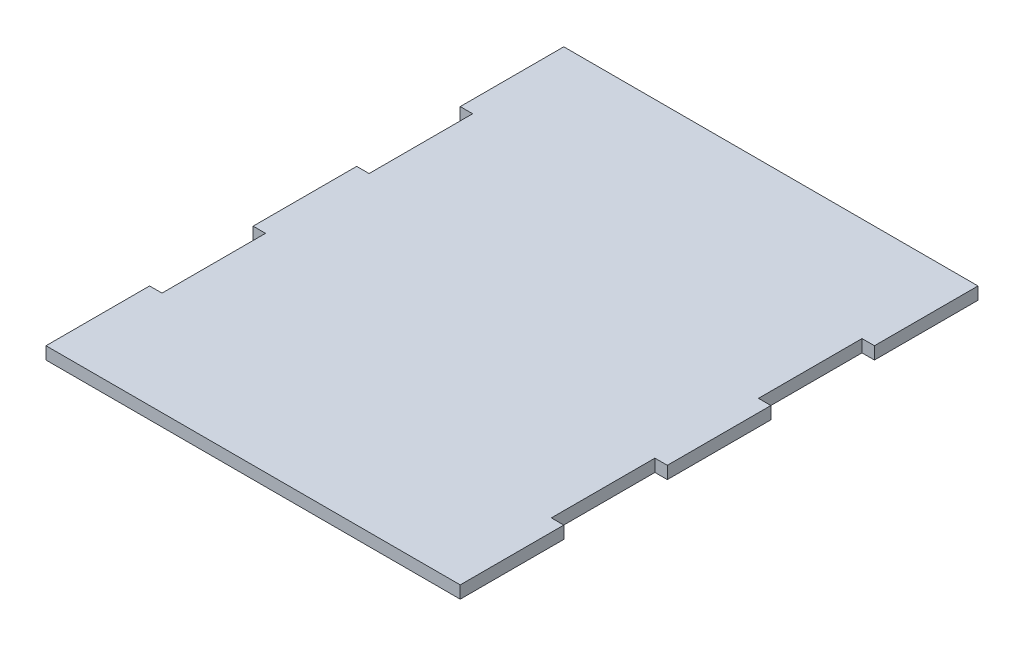
ISO-10303-21;
HEADER;
FILE_DESCRIPTION(('STEP AP214'),'2;1');
FILE_NAME('part.step','',(''),(''),'','','');
FILE_SCHEMA(('AUTOMOTIVE_DESIGN { 1 0 10303 214 1 1 1 1 }'));
ENDSEC;
DATA;
#1=APPLICATION_CONTEXT('core data for automotive mechanical design processes');
#2=APPLICATION_PROTOCOL_DEFINITION('international standard','automotive_design',2000,#1);
#3=PRODUCT_CONTEXT('',#1,'mechanical');
#4=PRODUCT('Part','Part','',(#3));
#5=PRODUCT_RELATED_PRODUCT_CATEGORY('part','',(#4));
#6=PRODUCT_DEFINITION_FORMATION('','',#4);
#7=PRODUCT_DEFINITION_CONTEXT('part definition',#1,'design');
#8=PRODUCT_DEFINITION('design','',#6,#7);
#9=PRODUCT_DEFINITION_SHAPE('','',#8);
#10=(LENGTH_UNIT() NAMED_UNIT(*) SI_UNIT(.MILLI.,.METRE.));
#11=(NAMED_UNIT(*) PLANE_ANGLE_UNIT() SI_UNIT($,.RADIAN.));
#12=(NAMED_UNIT(*) SI_UNIT($,.STERADIAN.) SOLID_ANGLE_UNIT());
#13=UNCERTAINTY_MEASURE_WITH_UNIT(LENGTH_MEASURE(1.E-05),#10,'distance_accuracy_value','');
#14=(GEOMETRIC_REPRESENTATION_CONTEXT(3) GLOBAL_UNCERTAINTY_ASSIGNED_CONTEXT((#13)) GLOBAL_UNIT_ASSIGNED_CONTEXT((#10,
#11,#12)) REPRESENTATION_CONTEXT('',''));
#15=CARTESIAN_POINT('',(0.,0.,0.));
#16=DIRECTION('',(0.,0.,1.));
#17=DIRECTION('',(1.,0.,0.));
#18=AXIS2_PLACEMENT_3D('',#15,#16,#17);
#19=CARTESIAN_POINT('',(100.,6.,-125.));
#20=DIRECTION('',(-1.,0.,0.));
#21=DIRECTION('',(0.,0.,1.));
#22=AXIS2_PLACEMENT_3D('',#19,#20,#21);
#23=PLANE('',#22);
#24=DIRECTION('',(0.,0.,-1.));
#25=VECTOR('',#24,1.);
#26=CARTESIAN_POINT('',(100.,6.,-125.));
#27=LINE('',#26,#25);
#28=CARTESIAN_POINT('',(100.000000000001,6.,25.));
#29=VERTEX_POINT('',#28);
#30=CARTESIAN_POINT('',(100.,6.,-25.));
#31=VERTEX_POINT('',#30);
#32=EDGE_CURVE('E334',#29,#31,#27,.T.);
#33=ORIENTED_EDGE('',*,*,#32,.F.);
#34=DIRECTION('',(0.,1.,0.));
#35=VECTOR('',#34,1.);
#36=CARTESIAN_POINT('',(100.000000000001,0.,25.));
#37=LINE('',#36,#35);
#38=CARTESIAN_POINT('',(100.000000000001,0.,25.));
#39=VERTEX_POINT('',#38);
#40=EDGE_CURVE('E214',#39,#29,#37,.T.);
#41=ORIENTED_EDGE('',*,*,#40,.F.);
#42=DIRECTION('',(0.,0.,-1.));
#43=VECTOR('',#42,1.);
#44=CARTESIAN_POINT('',(100.,0.,-125.));
#45=LINE('',#44,#43);
#46=CARTESIAN_POINT('',(100.,0.,-25.));
#47=VERTEX_POINT('',#46);
#48=EDGE_CURVE('E353',#39,#47,#45,.T.);
#49=ORIENTED_EDGE('',*,*,#48,.T.);
#50=DIRECTION('',(0.,1.,0.));
#51=VECTOR('',#50,1.);
#52=CARTESIAN_POINT('',(100.,0.,-25.));
#53=LINE('',#52,#51);
#54=EDGE_CURVE('E221',#47,#31,#53,.T.);
#55=ORIENTED_EDGE('',*,*,#54,.T.);
#56=EDGE_LOOP('',(#33,#41,#49,#55));
#57=FACE_BOUND('',#56,.T.);
#58=ADVANCED_FACE('F39',(#57),#23,.F.);
#59=CARTESIAN_POINT('',(100.,6.,-75.));
#60=VERTEX_POINT('',#59);
#61=CARTESIAN_POINT('',(100.,6.,-125.));
#62=VERTEX_POINT('',#61);
#63=EDGE_CURVE('E335',#60,#62,#27,.T.);
#64=ORIENTED_EDGE('',*,*,#63,.F.);
#65=DIRECTION('',(0.,1.,0.));
#66=VECTOR('',#65,1.);
#67=CARTESIAN_POINT('',(100.,0.,-75.));
#68=LINE('',#67,#66);
#69=CARTESIAN_POINT('',(100.,0.,-75.));
#70=VERTEX_POINT('',#69);
#71=EDGE_CURVE('E217',#70,#60,#68,.T.);
#72=ORIENTED_EDGE('',*,*,#71,.F.);
#73=CARTESIAN_POINT('',(100.,0.,-125.));
#74=VERTEX_POINT('',#73);
#75=EDGE_CURVE('E202',#70,#74,#45,.T.);
#76=ORIENTED_EDGE('',*,*,#75,.T.);
#77=DIRECTION('',(0.,-1.,0.));
#78=VECTOR('',#77,1.);
#79=CARTESIAN_POINT('',(100.,6.,-125.));
#80=LINE('',#79,#78);
#81=EDGE_CURVE('E11',#62,#74,#80,.T.);
#82=ORIENTED_EDGE('',*,*,#81,.F.);
#83=EDGE_LOOP('',(#64,#72,#76,#82));
#84=FACE_BOUND('',#83,.T.);
#85=ADVANCED_FACE('F392',(#84),#23,.F.);
#86=CARTESIAN_POINT('',(-100.,6.,-125.));
#87=DIRECTION('',(1.,0.,0.));
#88=DIRECTION('',(0.,0.,-1.));
#89=AXIS2_PLACEMENT_3D('',#86,#87,#88);
#90=PLANE('',#89);
#91=DIRECTION('',(0.,0.,1.));
#92=VECTOR('',#91,1.);
#93=CARTESIAN_POINT('',(-100.,0.,-125.));
#94=LINE('',#93,#92);
#95=CARTESIAN_POINT('',(-100.,0.,-25.));
#96=VERTEX_POINT('',#95);
#97=CARTESIAN_POINT('',(-99.999999999999,0.,25.));
#98=VERTEX_POINT('',#97);
#99=EDGE_CURVE('E362',#96,#98,#94,.T.);
#100=ORIENTED_EDGE('',*,*,#99,.T.);
#101=DIRECTION('',(0.,1.,0.));
#102=VECTOR('',#101,1.);
#103=CARTESIAN_POINT('',(-99.999999999999,0.,25.));
#104=LINE('',#103,#102);
#105=CARTESIAN_POINT('',(-99.999999999999,6.,25.));
#106=VERTEX_POINT('',#105);
#107=EDGE_CURVE('E272',#98,#106,#104,.T.);
#108=ORIENTED_EDGE('',*,*,#107,.T.);
#109=DIRECTION('',(0.,0.,1.));
#110=VECTOR('',#109,1.);
#111=CARTESIAN_POINT('',(-100.,6.,-125.));
#112=LINE('',#111,#110);
#113=CARTESIAN_POINT('',(-100.,6.,-25.));
#114=VERTEX_POINT('',#113);
#115=EDGE_CURVE('E344',#114,#106,#112,.T.);
#116=ORIENTED_EDGE('',*,*,#115,.F.);
#117=DIRECTION('',(0.,1.,0.));
#118=VECTOR('',#117,1.);
#119=CARTESIAN_POINT('',(-100.,0.,-25.));
#120=LINE('',#119,#118);
#121=EDGE_CURVE('E307',#96,#114,#120,.T.);
#122=ORIENTED_EDGE('',*,*,#121,.F.);
#123=EDGE_LOOP('',(#100,#108,#116,#122));
#124=FACE_BOUND('',#123,.T.);
#125=ADVANCED_FACE('F435',(#124),#90,.F.);
#126=CARTESIAN_POINT('',(-100.,0.,-125.));
#127=VERTEX_POINT('',#126);
#128=CARTESIAN_POINT('',(-100.,0.,-75.));
#129=VERTEX_POINT('',#128);
#130=EDGE_CURVE('E357',#127,#129,#94,.T.);
#131=ORIENTED_EDGE('',*,*,#130,.T.);
#132=DIRECTION('',(0.,1.,0.));
#133=VECTOR('',#132,1.);
#134=CARTESIAN_POINT('',(-100.,0.,-75.));
#135=LINE('',#134,#133);
#136=CARTESIAN_POINT('',(-100.,6.,-75.));
#137=VERTEX_POINT('',#136);
#138=EDGE_CURVE('E317',#129,#137,#135,.T.);
#139=ORIENTED_EDGE('',*,*,#138,.T.);
#140=CARTESIAN_POINT('',(-100.,6.,-125.));
#141=VERTEX_POINT('',#140);
#142=EDGE_CURVE('E339',#141,#137,#112,.T.);
#143=ORIENTED_EDGE('',*,*,#142,.F.);
#144=DIRECTION('',(0.,-1.,0.));
#145=VECTOR('',#144,1.);
#146=CARTESIAN_POINT('',(-100.,6.,-125.));
#147=LINE('',#146,#145);
#148=EDGE_CURVE('E48',#141,#127,#147,.T.);
#149=ORIENTED_EDGE('',*,*,#148,.T.);
#150=EDGE_LOOP('',(#131,#139,#143,#149));
#151=FACE_BOUND('',#150,.T.);
#152=ADVANCED_FACE('F377',(#151),#90,.F.);
#153=CARTESIAN_POINT('',(100.,0.,125.));
#154=VERTEX_POINT('',#153);
#155=CARTESIAN_POINT('',(100.000000000001,0.,75.));
#156=VERTEX_POINT('',#155);
#157=EDGE_CURVE('E348',#154,#156,#45,.T.);
#158=ORIENTED_EDGE('',*,*,#157,.T.);
#159=DIRECTION('',(0.,1.,0.));
#160=VECTOR('',#159,1.);
#161=CARTESIAN_POINT('',(100.000000000001,0.,75.));
#162=LINE('',#161,#160);
#163=CARTESIAN_POINT('',(100.000000000001,6.,75.));
#164=VERTEX_POINT('',#163);
#165=EDGE_CURVE('E252',#156,#164,#162,.T.);
#166=ORIENTED_EDGE('',*,*,#165,.T.);
#167=CARTESIAN_POINT('',(100.,6.,125.));
#168=VERTEX_POINT('',#167);
#169=EDGE_CURVE('E329',#168,#164,#27,.T.);
#170=ORIENTED_EDGE('',*,*,#169,.F.);
#171=DIRECTION('',(0.,-1.,0.));
#172=VECTOR('',#171,1.);
#173=CARTESIAN_POINT('',(100.,6.,125.));
#174=LINE('',#173,#172);
#175=EDGE_CURVE('E347',#168,#154,#174,.T.);
#176=ORIENTED_EDGE('',*,*,#175,.T.);
#177=EDGE_LOOP('',(#158,#166,#170,#176));
#178=FACE_BOUND('',#177,.T.);
#179=ADVANCED_FACE('F41',(#178),#23,.F.);
#180=CARTESIAN_POINT('',(-100.,6.,-125.));
#181=DIRECTION('',(0.,0.,1.));
#182=DIRECTION('',(1.,0.,0.));
#183=AXIS2_PLACEMENT_3D('',#180,#181,#182);
#184=PLANE('',#183);
#185=DIRECTION('',(-1.,0.,0.));
#186=VECTOR('',#185,1.);
#187=CARTESIAN_POINT('',(-100.,0.,-125.));
#188=LINE('',#187,#186);
#189=EDGE_CURVE('E352',#74,#127,#188,.T.);
#190=ORIENTED_EDGE('',*,*,#189,.T.);
#191=ORIENTED_EDGE('',*,*,#148,.F.);
#192=DIRECTION('',(-1.,0.,0.));
#193=VECTOR('',#192,1.);
#194=CARTESIAN_POINT('',(-100.,6.,-125.));
#195=LINE('',#194,#193);
#196=EDGE_CURVE('E333',#62,#141,#195,.T.);
#197=ORIENTED_EDGE('',*,*,#196,.F.);
#198=ORIENTED_EDGE('',*,*,#81,.T.);
#199=EDGE_LOOP('',(#190,#191,#197,#198));
#200=FACE_BOUND('',#199,.T.);
#201=ADVANCED_FACE('F390',(#200),#184,.F.);
#202=CARTESIAN_POINT('',(-99.999999999999,6.,75.));
#203=VERTEX_POINT('',#202);
#204=CARTESIAN_POINT('',(-100.,6.,125.));
#205=VERTEX_POINT('',#204);
#206=EDGE_CURVE('E338',#203,#205,#112,.T.);
#207=ORIENTED_EDGE('',*,*,#206,.F.);
#208=DIRECTION('',(0.,1.,0.));
#209=VECTOR('',#208,1.);
#210=CARTESIAN_POINT('',(-99.999999999999,0.,75.));
#211=LINE('',#210,#209);
#212=CARTESIAN_POINT('',(-99.999999999999,0.,75.));
#213=VERTEX_POINT('',#212);
#214=EDGE_CURVE('E288',#213,#203,#211,.T.);
#215=ORIENTED_EDGE('',*,*,#214,.F.);
#216=CARTESIAN_POINT('',(-100.,0.,125.));
#217=VERTEX_POINT('',#216);
#218=EDGE_CURVE('E356',#213,#217,#94,.T.);
#219=ORIENTED_EDGE('',*,*,#218,.T.);
#220=DIRECTION('',(0.,-1.,0.));
#221=VECTOR('',#220,1.);
#222=CARTESIAN_POINT('',(-100.,6.,125.));
#223=LINE('',#222,#221);
#224=EDGE_CURVE('E368',#205,#217,#223,.T.);
#225=ORIENTED_EDGE('',*,*,#224,.F.);
#226=EDGE_LOOP('',(#207,#215,#219,#225));
#227=FACE_BOUND('',#226,.T.);
#228=ADVANCED_FACE('F416',(#227),#90,.F.);
#229=CARTESIAN_POINT('',(-100.,6.,125.));
#230=DIRECTION('',(0.,0.,-1.));
#231=DIRECTION('',(-1.,0.,0.));
#232=AXIS2_PLACEMENT_3D('',#229,#230,#231);
#233=PLANE('',#232);
#234=DIRECTION('',(1.,0.,0.));
#235=VECTOR('',#234,1.);
#236=CARTESIAN_POINT('',(-100.,0.,125.));
#237=LINE('',#236,#235);
#238=EDGE_CURVE('E361',#217,#154,#237,.T.);
#239=ORIENTED_EDGE('',*,*,#238,.T.);
#240=ORIENTED_EDGE('',*,*,#175,.F.);
#241=DIRECTION('',(1.,0.,0.));
#242=VECTOR('',#241,1.);
#243=CARTESIAN_POINT('',(-100.,6.,125.));
#244=LINE('',#243,#242);
#245=EDGE_CURVE('E343',#205,#168,#244,.T.);
#246=ORIENTED_EDGE('',*,*,#245,.F.);
#247=ORIENTED_EDGE('',*,*,#224,.T.);
#248=EDGE_LOOP('',(#239,#240,#246,#247));
#249=FACE_BOUND('',#248,.T.);
#250=ADVANCED_FACE('F420',(#249),#233,.F.);
#251=CARTESIAN_POINT('',(0.,6.,0.));
#252=DIRECTION('',(0.,1.,0.));
#253=DIRECTION('',(0.,0.,1.));
#254=AXIS2_PLACEMENT_3D('',#251,#252,#253);
#255=PLANE('',#254);
#256=DIRECTION('',(-1.,0.,0.));
#257=VECTOR('',#256,1.);
#258=CARTESIAN_POINT('',(-99.999999999999,6.,25.));
#259=LINE('',#258,#257);
#260=CARTESIAN_POINT('',(-93.999999999999,6.,25.));
#261=VERTEX_POINT('',#260);
#262=EDGE_CURVE('E273',#261,#106,#259,.T.);
#263=ORIENTED_EDGE('',*,*,#262,.F.);
#264=DIRECTION('',(0.,0.,-1.));
#265=VECTOR('',#264,1.);
#266=CARTESIAN_POINT('',(-93.999999999999,6.,25.));
#267=LINE('',#266,#265);
#268=CARTESIAN_POINT('',(-93.999999999999,6.,75.));
#269=VERTEX_POINT('',#268);
#270=EDGE_CURVE('E266',#269,#261,#267,.T.);
#271=ORIENTED_EDGE('',*,*,#270,.F.);
#272=DIRECTION('',(1.,0.,0.));
#273=VECTOR('',#272,1.);
#274=CARTESIAN_POINT('',(-99.999999999999,6.,75.));
#275=LINE('',#274,#273);
#276=EDGE_CURVE('E276',#203,#269,#275,.T.);
#277=ORIENTED_EDGE('',*,*,#276,.F.);
#278=ORIENTED_EDGE('',*,*,#206,.T.);
#279=ORIENTED_EDGE('',*,*,#245,.T.);
#280=ORIENTED_EDGE('',*,*,#169,.T.);
#281=DIRECTION('',(1.,0.,0.));
#282=VECTOR('',#281,1.);
#283=CARTESIAN_POINT('',(94.0000000000011,6.,75.));
#284=LINE('',#283,#282);
#285=CARTESIAN_POINT('',(94.0000000000011,6.,75.));
#286=VERTEX_POINT('',#285);
#287=EDGE_CURVE('E232',#286,#164,#284,.T.);
#288=ORIENTED_EDGE('',*,*,#287,.F.);
#289=DIRECTION('',(0.,0.,1.));
#290=VECTOR('',#289,1.);
#291=CARTESIAN_POINT('',(94.0000000000011,6.,25.));
#292=LINE('',#291,#290);
#293=CARTESIAN_POINT('',(94.0000000000011,6.,25.));
#294=VERTEX_POINT('',#293);
#295=EDGE_CURVE('E243',#294,#286,#292,.T.);
#296=ORIENTED_EDGE('',*,*,#295,.F.);
#297=DIRECTION('',(-1.,0.,0.));
#298=VECTOR('',#297,1.);
#299=CARTESIAN_POINT('',(94.0000000000011,6.,25.));
#300=LINE('',#299,#298);
#301=EDGE_CURVE('E239',#29,#294,#300,.T.);
#302=ORIENTED_EDGE('',*,*,#301,.F.);
#303=ORIENTED_EDGE('',*,*,#32,.T.);
#304=DIRECTION('',(1.,0.,0.));
#305=VECTOR('',#304,1.);
#306=CARTESIAN_POINT('',(94.,6.,-25.));
#307=LINE('',#306,#305);
#308=CARTESIAN_POINT('',(94.,6.,-25.));
#309=VERTEX_POINT('',#308);
#310=EDGE_CURVE('E204',#309,#31,#307,.T.);
#311=ORIENTED_EDGE('',*,*,#310,.F.);
#312=DIRECTION('',(0.,0.,1.));
#313=VECTOR('',#312,1.);
#314=CARTESIAN_POINT('',(94.,6.,-75.));
#315=LINE('',#314,#313);
#316=CARTESIAN_POINT('',(94.,6.,-75.));
#317=VERTEX_POINT('',#316);
#318=EDGE_CURVE('E207',#317,#309,#315,.T.);
#319=ORIENTED_EDGE('',*,*,#318,.F.);
#320=DIRECTION('',(-1.,0.,0.));
#321=VECTOR('',#320,1.);
#322=CARTESIAN_POINT('',(94.,6.,-75.));
#323=LINE('',#322,#321);
#324=EDGE_CURVE('E183',#60,#317,#323,.T.);
#325=ORIENTED_EDGE('',*,*,#324,.F.);
#326=ORIENTED_EDGE('',*,*,#63,.T.);
#327=ORIENTED_EDGE('',*,*,#196,.T.);
#328=ORIENTED_EDGE('',*,*,#142,.T.);
#329=DIRECTION('',(-1.,0.,0.));
#330=VECTOR('',#329,1.);
#331=CARTESIAN_POINT('',(-100.,6.,-75.));
#332=LINE('',#331,#330);
#333=CARTESIAN_POINT('',(-94.,6.,-75.));
#334=VERTEX_POINT('',#333);
#335=EDGE_CURVE('E299',#334,#137,#332,.T.);
#336=ORIENTED_EDGE('',*,*,#335,.F.);
#337=DIRECTION('',(0.,0.,-1.));
#338=VECTOR('',#337,1.);
#339=CARTESIAN_POINT('',(-94.,6.,-75.));
#340=LINE('',#339,#338);
#341=CARTESIAN_POINT('',(-94.,6.,-25.));
#342=VERTEX_POINT('',#341);
#343=EDGE_CURVE('E311',#342,#334,#340,.T.);
#344=ORIENTED_EDGE('',*,*,#343,.F.);
#345=DIRECTION('',(1.,0.,0.));
#346=VECTOR('',#345,1.);
#347=CARTESIAN_POINT('',(-100.,6.,-25.));
#348=LINE('',#347,#346);
#349=EDGE_CURVE('E220',#114,#342,#348,.T.);
#350=ORIENTED_EDGE('',*,*,#349,.F.);
#351=ORIENTED_EDGE('',*,*,#115,.T.);
#352=EDGE_LOOP('',(#263,#271,#277,#278,#279,#280,#288,#296,#302,#303,#311,#319,#325,#326,#327,
#328,#336,#344,#350,#351));
#353=FACE_BOUND('',#352,.T.);
#354=ADVANCED_FACE('F386',(#353),#255,.T.);
#355=CARTESIAN_POINT('',(0.,0.,0.));
#356=DIRECTION('',(0.,1.,0.));
#357=DIRECTION('',(0.,0.,1.));
#358=AXIS2_PLACEMENT_3D('',#355,#356,#357);
#359=PLANE('',#358);
#360=DIRECTION('',(0.,0.,-1.));
#361=VECTOR('',#360,1.);
#362=CARTESIAN_POINT('',(-93.999999999999,0.,25.));
#363=LINE('',#362,#361);
#364=CARTESIAN_POINT('',(-93.999999999999,0.,75.));
#365=VERTEX_POINT('',#364);
#366=CARTESIAN_POINT('',(-93.999999999999,0.,25.));
#367=VERTEX_POINT('',#366);
#368=EDGE_CURVE('E55',#365,#367,#363,.T.);
#369=ORIENTED_EDGE('',*,*,#368,.T.);
#370=DIRECTION('',(-1.,0.,0.));
#371=VECTOR('',#370,1.);
#372=CARTESIAN_POINT('',(-99.999999999999,0.,25.));
#373=LINE('',#372,#371);
#374=EDGE_CURVE('E261',#367,#98,#373,.T.);
#375=ORIENTED_EDGE('',*,*,#374,.T.);
#376=ORIENTED_EDGE('',*,*,#99,.F.);
#377=DIRECTION('',(1.,0.,0.));
#378=VECTOR('',#377,1.);
#379=CARTESIAN_POINT('',(-100.,0.,-25.));
#380=LINE('',#379,#378);
#381=CARTESIAN_POINT('',(-94.,0.,-25.));
#382=VERTEX_POINT('',#381);
#383=EDGE_CURVE('E294',#96,#382,#380,.T.);
#384=ORIENTED_EDGE('',*,*,#383,.T.);
#385=DIRECTION('',(0.,0.,-1.));
#386=VECTOR('',#385,1.);
#387=CARTESIAN_POINT('',(-94.,0.,-75.));
#388=LINE('',#387,#386);
#389=CARTESIAN_POINT('',(-94.,0.,-75.));
#390=VERTEX_POINT('',#389);
#391=EDGE_CURVE('E298',#382,#390,#388,.T.);
#392=ORIENTED_EDGE('',*,*,#391,.T.);
#393=DIRECTION('',(-1.,0.,0.));
#394=VECTOR('',#393,1.);
#395=CARTESIAN_POINT('',(-100.,0.,-75.));
#396=LINE('',#395,#394);
#397=EDGE_CURVE('E303',#390,#129,#396,.T.);
#398=ORIENTED_EDGE('',*,*,#397,.T.);
#399=ORIENTED_EDGE('',*,*,#130,.F.);
#400=ORIENTED_EDGE('',*,*,#189,.F.);
#401=ORIENTED_EDGE('',*,*,#75,.F.);
#402=DIRECTION('',(-1.,0.,0.));
#403=VECTOR('',#402,1.);
#404=CARTESIAN_POINT('',(94.,0.,-75.));
#405=LINE('',#404,#403);
#406=CARTESIAN_POINT('',(94.,0.,-75.));
#407=VERTEX_POINT('',#406);
#408=EDGE_CURVE('E180',#70,#407,#405,.T.);
#409=ORIENTED_EDGE('',*,*,#408,.T.);
#410=DIRECTION('',(0.,0.,1.));
#411=VECTOR('',#410,1.);
#412=CARTESIAN_POINT('',(94.,0.,-75.));
#413=LINE('',#412,#411);
#414=CARTESIAN_POINT('',(94.,0.,-25.));
#415=VERTEX_POINT('',#414);
#416=EDGE_CURVE('E193',#407,#415,#413,.T.);
#417=ORIENTED_EDGE('',*,*,#416,.T.);
#418=DIRECTION('',(1.,0.,0.));
#419=VECTOR('',#418,1.);
#420=CARTESIAN_POINT('',(94.,0.,-25.));
#421=LINE('',#420,#419);
#422=EDGE_CURVE('E189',#415,#47,#421,.T.);
#423=ORIENTED_EDGE('',*,*,#422,.T.);
#424=ORIENTED_EDGE('',*,*,#48,.F.);
#425=DIRECTION('',(-1.,0.,0.));
#426=VECTOR('',#425,1.);
#427=CARTESIAN_POINT('',(94.0000000000011,0.,25.));
#428=LINE('',#427,#426);
#429=CARTESIAN_POINT('',(94.0000000000011,0.,25.));
#430=VERTEX_POINT('',#429);
#431=EDGE_CURVE('E227',#39,#430,#428,.T.);
#432=ORIENTED_EDGE('',*,*,#431,.T.);
#433=DIRECTION('',(0.,0.,1.));
#434=VECTOR('',#433,1.);
#435=CARTESIAN_POINT('',(94.0000000000011,0.,25.));
#436=LINE('',#435,#434);
#437=CARTESIAN_POINT('',(94.0000000000011,0.,75.));
#438=VERTEX_POINT('',#437);
#439=EDGE_CURVE('E231',#430,#438,#436,.T.);
#440=ORIENTED_EDGE('',*,*,#439,.T.);
#441=DIRECTION('',(1.,0.,0.));
#442=VECTOR('',#441,1.);
#443=CARTESIAN_POINT('',(94.0000000000011,0.,75.));
#444=LINE('',#443,#442);
#445=EDGE_CURVE('E63',#438,#156,#444,.T.);
#446=ORIENTED_EDGE('',*,*,#445,.T.);
#447=ORIENTED_EDGE('',*,*,#157,.F.);
#448=ORIENTED_EDGE('',*,*,#238,.F.);
#449=ORIENTED_EDGE('',*,*,#218,.F.);
#450=DIRECTION('',(1.,0.,0.));
#451=VECTOR('',#450,1.);
#452=CARTESIAN_POINT('',(-99.999999999999,0.,75.));
#453=LINE('',#452,#451);
#454=EDGE_CURVE('E265',#213,#365,#453,.T.);
#455=ORIENTED_EDGE('',*,*,#454,.T.);
#456=EDGE_LOOP('',(#369,#375,#376,#384,#392,#398,#399,#400,#401,#409,#417,#423,#424,#432,#440,
#446,#447,#448,#449,#455));
#457=FACE_BOUND('',#456,.T.);
#458=ADVANCED_FACE('F200',(#457),#359,.F.);
#459=CARTESIAN_POINT('',(-100.,0.,-75.));
#460=DIRECTION('',(0.,0.,-1.));
#461=DIRECTION('',(-1.,0.,0.));
#462=AXIS2_PLACEMENT_3D('',#459,#460,#461);
#463=PLANE('',#462);
#464=ORIENTED_EDGE('',*,*,#335,.T.);
#465=ORIENTED_EDGE('',*,*,#138,.F.);
#466=ORIENTED_EDGE('',*,*,#397,.F.);
#467=DIRECTION('',(0.,1.,0.));
#468=VECTOR('',#467,1.);
#469=CARTESIAN_POINT('',(-94.,0.,-75.));
#470=LINE('',#469,#468);
#471=EDGE_CURVE('E321',#390,#334,#470,.T.);
#472=ORIENTED_EDGE('',*,*,#471,.T.);
#473=EDGE_LOOP('',(#464,#465,#466,#472));
#474=FACE_BOUND('',#473,.T.);
#475=ADVANCED_FACE('F382',(#474),#463,.F.);
#476=CARTESIAN_POINT('',(-94.,0.,-75.));
#477=DIRECTION('',(1.,0.,0.));
#478=DIRECTION('',(0.,0.,-1.));
#479=AXIS2_PLACEMENT_3D('',#476,#477,#478);
#480=PLANE('',#479);
#481=ORIENTED_EDGE('',*,*,#343,.T.);
#482=ORIENTED_EDGE('',*,*,#471,.F.);
#483=ORIENTED_EDGE('',*,*,#391,.F.);
#484=DIRECTION('',(0.,1.,0.));
#485=VECTOR('',#484,1.);
#486=CARTESIAN_POINT('',(-94.,0.,-25.));
#487=LINE('',#486,#485);
#488=EDGE_CURVE('E324',#382,#342,#487,.T.);
#489=ORIENTED_EDGE('',*,*,#488,.T.);
#490=EDGE_LOOP('',(#481,#482,#483,#489));
#491=FACE_BOUND('',#490,.T.);
#492=ADVANCED_FACE('F481',(#491),#480,.F.);
#493=CARTESIAN_POINT('',(-100.,0.,-25.));
#494=DIRECTION('',(0.,0.,1.));
#495=DIRECTION('',(1.,0.,0.));
#496=AXIS2_PLACEMENT_3D('',#493,#494,#495);
#497=PLANE('',#496);
#498=ORIENTED_EDGE('',*,*,#349,.T.);
#499=ORIENTED_EDGE('',*,*,#488,.F.);
#500=ORIENTED_EDGE('',*,*,#383,.F.);
#501=ORIENTED_EDGE('',*,*,#121,.T.);
#502=EDGE_LOOP('',(#498,#499,#500,#501));
#503=FACE_BOUND('',#502,.T.);
#504=ADVANCED_FACE('F478',(#503),#497,.F.);
#505=CARTESIAN_POINT('',(94.,0.,-75.));
#506=DIRECTION('',(0.,0.,-1.));
#507=DIRECTION('',(-1.,0.,0.));
#508=AXIS2_PLACEMENT_3D('',#505,#506,#507);
#509=PLANE('',#508);
#510=ORIENTED_EDGE('',*,*,#324,.T.);
#511=DIRECTION('',(0.,1.,0.));
#512=VECTOR('',#511,1.);
#513=CARTESIAN_POINT('',(94.,0.,-75.));
#514=LINE('',#513,#512);
#515=EDGE_CURVE('E176',#407,#317,#514,.T.);
#516=ORIENTED_EDGE('',*,*,#515,.F.);
#517=ORIENTED_EDGE('',*,*,#408,.F.);
#518=ORIENTED_EDGE('',*,*,#71,.T.);
#519=EDGE_LOOP('',(#510,#516,#517,#518));
#520=FACE_BOUND('',#519,.T.);
#521=ADVANCED_FACE('F178',(#520),#509,.F.);
#522=CARTESIAN_POINT('',(94.,0.,-25.));
#523=DIRECTION('',(0.,0.,1.));
#524=DIRECTION('',(1.,0.,0.));
#525=AXIS2_PLACEMENT_3D('',#522,#523,#524);
#526=PLANE('',#525);
#527=ORIENTED_EDGE('',*,*,#310,.T.);
#528=ORIENTED_EDGE('',*,*,#54,.F.);
#529=ORIENTED_EDGE('',*,*,#422,.F.);
#530=DIRECTION('',(0.,1.,0.));
#531=VECTOR('',#530,1.);
#532=CARTESIAN_POINT('',(94.,0.,-25.));
#533=LINE('',#532,#531);
#534=EDGE_CURVE('E188',#415,#309,#533,.T.);
#535=ORIENTED_EDGE('',*,*,#534,.T.);
#536=EDGE_LOOP('',(#527,#528,#529,#535));
#537=FACE_BOUND('',#536,.T.);
#538=ADVANCED_FACE('F402',(#537),#526,.F.);
#539=CARTESIAN_POINT('',(94.,0.,-75.));
#540=DIRECTION('',(-1.,0.,0.));
#541=DIRECTION('',(0.,0.,1.));
#542=AXIS2_PLACEMENT_3D('',#539,#540,#541);
#543=PLANE('',#542);
#544=ORIENTED_EDGE('',*,*,#318,.T.);
#545=ORIENTED_EDGE('',*,*,#534,.F.);
#546=ORIENTED_EDGE('',*,*,#416,.F.);
#547=ORIENTED_EDGE('',*,*,#515,.T.);
#548=EDGE_LOOP('',(#544,#545,#546,#547));
#549=FACE_BOUND('',#548,.T.);
#550=ADVANCED_FACE('F194',(#549),#543,.F.);
#551=CARTESIAN_POINT('',(94.0000000000011,0.,25.));
#552=DIRECTION('',(0.,0.,-1.));
#553=DIRECTION('',(-1.,0.,0.));
#554=AXIS2_PLACEMENT_3D('',#551,#552,#553);
#555=PLANE('',#554);
#556=ORIENTED_EDGE('',*,*,#301,.T.);
#557=DIRECTION('',(0.,1.,0.));
#558=VECTOR('',#557,1.);
#559=CARTESIAN_POINT('',(94.0000000000011,0.,25.));
#560=LINE('',#559,#558);
#561=EDGE_CURVE('E238',#430,#294,#560,.T.);
#562=ORIENTED_EDGE('',*,*,#561,.F.);
#563=ORIENTED_EDGE('',*,*,#431,.F.);
#564=ORIENTED_EDGE('',*,*,#40,.T.);
#565=EDGE_LOOP('',(#556,#562,#563,#564));
#566=FACE_BOUND('',#565,.T.);
#567=ADVANCED_FACE('F517',(#566),#555,.F.);
#568=CARTESIAN_POINT('',(94.0000000000011,0.,75.));
#569=DIRECTION('',(0.,0.,1.));
#570=DIRECTION('',(1.,0.,0.));
#571=AXIS2_PLACEMENT_3D('',#568,#569,#570);
#572=PLANE('',#571);
#573=ORIENTED_EDGE('',*,*,#287,.T.);
#574=ORIENTED_EDGE('',*,*,#165,.F.);
#575=ORIENTED_EDGE('',*,*,#445,.F.);
#576=DIRECTION('',(0.,1.,0.));
#577=VECTOR('',#576,1.);
#578=CARTESIAN_POINT('',(94.0000000000011,0.,75.));
#579=LINE('',#578,#577);
#580=EDGE_CURVE('E256',#438,#286,#579,.T.);
#581=ORIENTED_EDGE('',*,*,#580,.T.);
#582=EDGE_LOOP('',(#573,#574,#575,#581));
#583=FACE_BOUND('',#582,.T.);
#584=ADVANCED_FACE('F524',(#583),#572,.F.);
#585=CARTESIAN_POINT('',(94.0000000000011,0.,25.));
#586=DIRECTION('',(-1.,0.,0.));
#587=DIRECTION('',(0.,0.,1.));
#588=AXIS2_PLACEMENT_3D('',#585,#586,#587);
#589=PLANE('',#588);
#590=ORIENTED_EDGE('',*,*,#295,.T.);
#591=ORIENTED_EDGE('',*,*,#580,.F.);
#592=ORIENTED_EDGE('',*,*,#439,.F.);
#593=ORIENTED_EDGE('',*,*,#561,.T.);
#594=EDGE_LOOP('',(#590,#591,#592,#593));
#595=FACE_BOUND('',#594,.T.);
#596=ADVANCED_FACE('F450',(#595),#589,.F.);
#597=CARTESIAN_POINT('',(-99.999999999999,0.,25.));
#598=DIRECTION('',(0.,0.,-1.));
#599=DIRECTION('',(-1.,0.,0.));
#600=AXIS2_PLACEMENT_3D('',#597,#598,#599);
#601=PLANE('',#600);
#602=ORIENTED_EDGE('',*,*,#262,.T.);
#603=ORIENTED_EDGE('',*,*,#107,.F.);
#604=ORIENTED_EDGE('',*,*,#374,.F.);
#605=DIRECTION('',(0.,1.,0.));
#606=VECTOR('',#605,1.);
#607=CARTESIAN_POINT('',(-93.999999999999,0.,25.));
#608=LINE('',#607,#606);
#609=EDGE_CURVE('E244',#367,#261,#608,.T.);
#610=ORIENTED_EDGE('',*,*,#609,.T.);
#611=EDGE_LOOP('',(#602,#603,#604,#610));
#612=FACE_BOUND('',#611,.T.);
#613=ADVANCED_FACE('F439',(#612),#601,.F.);
#614=CARTESIAN_POINT('',(-93.999999999999,0.,25.));
#615=DIRECTION('',(1.,0.,0.));
#616=DIRECTION('',(0.,0.,-1.));
#617=AXIS2_PLACEMENT_3D('',#614,#615,#616);
#618=PLANE('',#617);
#619=ORIENTED_EDGE('',*,*,#270,.T.);
#620=ORIENTED_EDGE('',*,*,#609,.F.);
#621=ORIENTED_EDGE('',*,*,#368,.F.);
#622=DIRECTION('',(0.,1.,0.));
#623=VECTOR('',#622,1.);
#624=CARTESIAN_POINT('',(-93.999999999999,0.,75.));
#625=LINE('',#624,#623);
#626=EDGE_CURVE('E285',#365,#269,#625,.T.);
#627=ORIENTED_EDGE('',*,*,#626,.T.);
#628=EDGE_LOOP('',(#619,#620,#621,#627));
#629=FACE_BOUND('',#628,.T.);
#630=ADVANCED_FACE('F442',(#629),#618,.F.);
#631=CARTESIAN_POINT('',(-99.999999999999,0.,75.));
#632=DIRECTION('',(0.,0.,1.));
#633=DIRECTION('',(1.,0.,0.));
#634=AXIS2_PLACEMENT_3D('',#631,#632,#633);
#635=PLANE('',#634);
#636=ORIENTED_EDGE('',*,*,#276,.T.);
#637=ORIENTED_EDGE('',*,*,#626,.F.);
#638=ORIENTED_EDGE('',*,*,#454,.F.);
#639=ORIENTED_EDGE('',*,*,#214,.T.);
#640=EDGE_LOOP('',(#636,#637,#638,#639));
#641=FACE_BOUND('',#640,.T.);
#642=ADVANCED_FACE('F441',(#641),#635,.F.);
#643=CLOSED_SHELL('',(#58,#85,#125,#152,#179,#201,#228,#250,#354,#458,#475,#492,#504,#521,#538,
#550,#567,#584,#596,#613,#630,#642));
#644=MANIFOLD_SOLID_BREP('B2',#643);
#645=ADVANCED_BREP_SHAPE_REPRESENTATION('',(#18,#644),#14);
#646=SHAPE_DEFINITION_REPRESENTATION(#9,#645);
ENDSEC;
END-ISO-10303-21;
